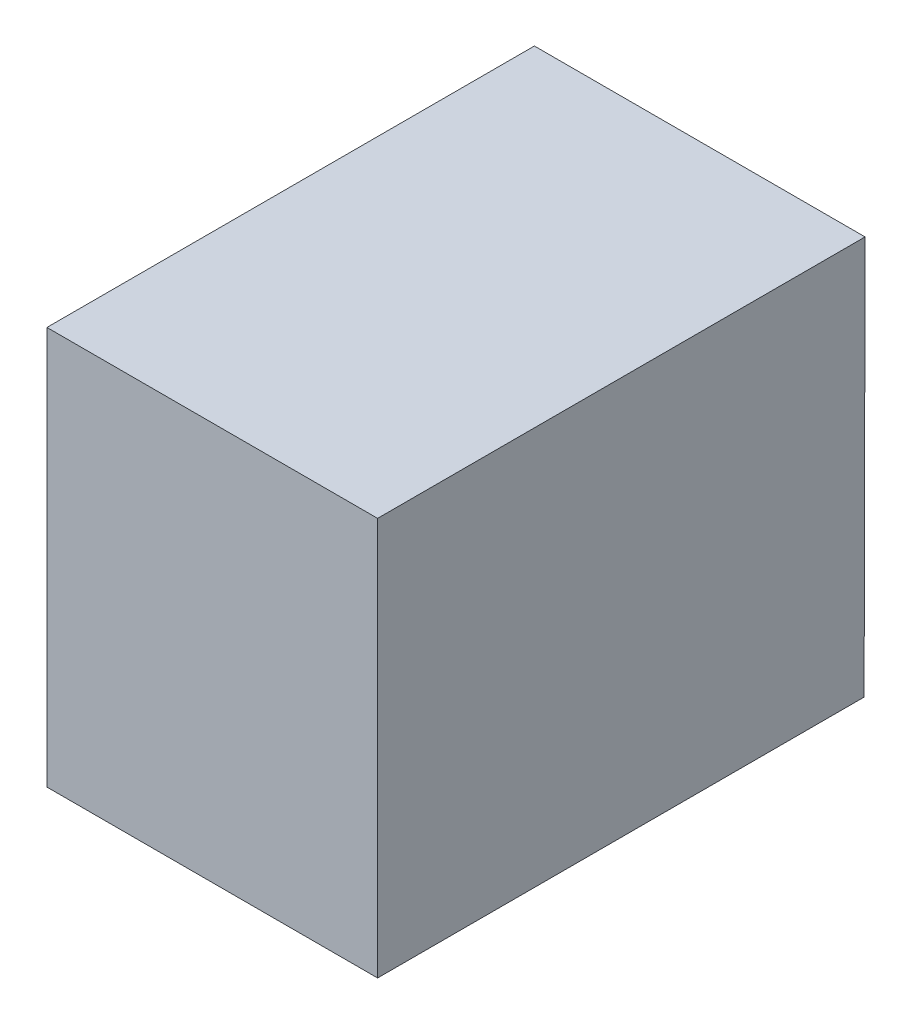
ISO-10303-21;
HEADER;
FILE_DESCRIPTION(('STEP AP214'),'2;1');
FILE_NAME('part.step','',(''),(''),'','','');
FILE_SCHEMA(('AUTOMOTIVE_DESIGN { 1 0 10303 214 1 1 1 1 }'));
ENDSEC;
DATA;
#1=APPLICATION_CONTEXT('core data for automotive mechanical design processes');
#2=APPLICATION_PROTOCOL_DEFINITION('international standard','automotive_design',2000,#1);
#3=PRODUCT_CONTEXT('',#1,'mechanical');
#4=PRODUCT('Part','Part','',(#3));
#5=PRODUCT_RELATED_PRODUCT_CATEGORY('part','',(#4));
#6=PRODUCT_DEFINITION_FORMATION('','',#4);
#7=PRODUCT_DEFINITION_CONTEXT('part definition',#1,'design');
#8=PRODUCT_DEFINITION('design','',#6,#7);
#9=PRODUCT_DEFINITION_SHAPE('','',#8);
#10=(LENGTH_UNIT() NAMED_UNIT(*) SI_UNIT(.MILLI.,.METRE.));
#11=(NAMED_UNIT(*) PLANE_ANGLE_UNIT() SI_UNIT($,.RADIAN.));
#12=(NAMED_UNIT(*) SI_UNIT($,.STERADIAN.) SOLID_ANGLE_UNIT());
#13=UNCERTAINTY_MEASURE_WITH_UNIT(LENGTH_MEASURE(1.E-05),#10,'distance_accuracy_value','');
#14=(GEOMETRIC_REPRESENTATION_CONTEXT(3) GLOBAL_UNCERTAINTY_ASSIGNED_CONTEXT((#13)) GLOBAL_UNIT_ASSIGNED_CONTEXT((#10,
#11,#12)) REPRESENTATION_CONTEXT('',''));
#15=CARTESIAN_POINT('',(0.,0.,0.));
#16=DIRECTION('',(0.,0.,1.));
#17=DIRECTION('',(1.,0.,0.));
#18=AXIS2_PLACEMENT_3D('',#15,#16,#17);
#19=CARTESIAN_POINT('',(-100.2,-54.,-68.8));
#20=DIRECTION('',(-1.,0.,0.));
#21=DIRECTION('',(0.,0.,1.));
#22=AXIS2_PLACEMENT_3D('',#19,#20,#21);
#23=PLANE('',#22);
#24=DIRECTION('',(0.,0.,1.));
#25=VECTOR('',#24,1.);
#26=CARTESIAN_POINT('',(-100.2,-34.94251995706,-68.8));
#27=LINE('',#26,#25);
#28=CARTESIAN_POINT('',(-100.2,-34.9425199575582,-12.7367436987511));
#29=VERTEX_POINT('',#28);
#30=CARTESIAN_POINT('',(-100.199999999925,-34.94251995706,-6.92509816158961));
#31=VERTEX_POINT('',#30);
#32=EDGE_CURVE('E58',#29,#31,#27,.T.);
#33=ORIENTED_EDGE('',*,*,#32,.T.);
#34=DIRECTION('',(0.,1.,0.));
#35=VECTOR('',#34,1.);
#36=CARTESIAN_POINT('',(-100.199999999699,-32.56498733975,-6.92509764656123));
#37=LINE('',#36,#35);
#38=CARTESIAN_POINT('',(-100.19999999985,-30.1874940436016,-6.92509764656123));
#39=VERTEX_POINT('',#38);
#40=EDGE_CURVE('E53',#39,#31,#37,.F.);
#41=ORIENTED_EDGE('',*,*,#40,.F.);
#42=DIRECTION('',(0.,0.,1.));
#43=VECTOR('',#42,1.);
#44=CARTESIAN_POINT('',(-100.2,-30.1874940436016,-9.836521772214));
#45=LINE('',#44,#43);
#46=CARTESIAN_POINT('',(-100.2,-30.1874940436016,-12.7480051298377));
#47=VERTEX_POINT('',#46);
#48=EDGE_CURVE('E56',#47,#39,#45,.T.);
#49=ORIENTED_EDGE('',*,*,#48,.F.);
#50=DIRECTION('',(0.,0.999997195537945,-0.00236831506454706));
#51=VECTOR('',#50,1.);
#52=CARTESIAN_POINT('',(-100.2,-34.9424759710886,-12.7367438029252));
#53=LINE('',#52,#51);
#54=EDGE_CURVE('E70',#47,#29,#53,.F.);
#55=ORIENTED_EDGE('',*,*,#54,.T.);
#56=EDGE_LOOP('',(#33,#41,#49,#55));
#57=FACE_BOUND('',#56,.T.);
#58=ADVANCED_FACE('F17',(#57),#23,.T.);
#59=CARTESIAN_POINT('',(-98.22499351073,-32.56498733975,-6.925098676621));
#60=DIRECTION('',(5.21547538801281E-07,0.,0.999999999999864));
#61=DIRECTION('',(0.999999999999864,0.,-5.21547538801281E-07));
#62=AXIS2_PLACEMENT_3D('',#59,#60,#61);
#63=PLANE('',#62);
#64=DIRECTION('',(0.999999999910853,1.3342451356658E-05,-5.21547538754858E-07));
#65=VECTOR('',#64,1.);
#66=CARTESIAN_POINT('',(-98.2249677389744,-30.1874676918297,-6.92509867663444));
#67=LINE('',#66,#65);
#68=CARTESIAN_POINT('',(-96.2500000004695,-30.1874413409188,-6.9250996494485));
#69=VERTEX_POINT('',#68);
#70=EDGE_CURVE('E20',#39,#69,#67,.T.);
#71=ORIENTED_EDGE('',*,*,#70,.F.);
#72=ORIENTED_EDGE('',*,*,#40,.T.);
#73=DIRECTION('',(1.,0.,0.));
#74=VECTOR('',#73,1.);
#75=CARTESIAN_POINT('',(-98.225,-34.94251995706,-6.925098676618));
#76=LINE('',#75,#74);
#77=CARTESIAN_POINT('',(-96.25,-34.94251995706,-6.9250991344205));
#78=VERTEX_POINT('',#77);
#79=EDGE_CURVE('E75',#31,#78,#76,.T.);
#80=ORIENTED_EDGE('',*,*,#79,.T.);
#81=DIRECTION('',(0.,1.,0.));
#82=VECTOR('',#81,1.);
#83=CARTESIAN_POINT('',(-96.25,-54.,-6.925099592223));
#84=LINE('',#83,#82);
#85=EDGE_CURVE('E74',#78,#69,#84,.T.);
#86=ORIENTED_EDGE('',*,*,#85,.T.);
#87=EDGE_LOOP('',(#71,#72,#80,#86));
#88=FACE_BOUND('',#87,.T.);
#89=ADVANCED_FACE('F72',(#88),#63,.T.);
#90=CARTESIAN_POINT('',(-98.22496925742,-30.18746769185,-9.836521772214));
#91=DIRECTION('',(-1.33424513566599E-05,0.99999999991099,0.));
#92=DIRECTION('',(-0.99999999991099,-1.33424513566599E-05,0.));
#93=AXIS2_PLACEMENT_3D('',#90,#91,#92);
#94=PLANE('',#93);
#95=DIRECTION('',(-0.99999999991099,-1.33424513566599E-05,0.));
#96=VECTOR('',#95,1.);
#97=CARTESIAN_POINT('',(-98.22496925742,-30.18746769185,-12.74800609296));
#98=LINE('',#97,#96);
#99=CARTESIAN_POINT('',(-96.250000000313,-30.1874413409188,-12.7480056737852));
#100=VERTEX_POINT('',#99);
#101=EDGE_CURVE('E69',#100,#47,#98,.T.);
#102=ORIENTED_EDGE('',*,*,#101,.T.);
#103=ORIENTED_EDGE('',*,*,#48,.T.);
#104=ORIENTED_EDGE('',*,*,#70,.T.);
#105=DIRECTION('',(0.,0.,1.));
#106=VECTOR('',#105,1.);
#107=CARTESIAN_POINT('',(-96.250000000626,-30.1874413409188,-9.836521772214));
#108=LINE('',#107,#106);
#109=EDGE_CURVE('E77',#69,#100,#108,.F.);
#110=ORIENTED_EDGE('',*,*,#109,.T.);
#111=EDGE_LOOP('',(#102,#103,#104,#110));
#112=FACE_BOUND('',#111,.T.);
#113=ADVANCED_FACE('F66',(#112),#94,.T.);
#114=CARTESIAN_POINT('',(-98.22492057204,-32.56497381771,-12.74237449286));
#115=DIRECTION('',(-1.1194765665958E-11,0.00236831506454811,0.999997195537945));
#116=DIRECTION('',(0.,-0.999997195537945,0.00236831506454811));
#117=AXIS2_PLACEMENT_3D('',#114,#115,#116);
#118=PLANE('',#117);
#119=DIRECTION('',(0.,-0.999997195537945,0.00236831506454811));
#120=VECTOR('',#119,1.);
#121=CARTESIAN_POINT('',(-96.25,-32.5649738177099,-12.7423744928379));
#122=LINE('',#121,#120);
#123=CARTESIAN_POINT('',(-96.25,-34.94251995706,-12.7367436987081));
#124=VERTEX_POINT('',#123);
#125=EDGE_CURVE('E26',#100,#124,#122,.T.);
#126=ORIENTED_EDGE('',*,*,#125,.T.);
#127=DIRECTION('',(1.,0.,1.11947342706625E-11));
#128=VECTOR('',#127,1.);
#129=CARTESIAN_POINT('',(-98.22492057204,-34.9425199580563,-12.7367436987278));
#130=LINE('',#129,#128);
#131=EDGE_CURVE('E34',#124,#29,#130,.F.);
#132=ORIENTED_EDGE('',*,*,#131,.T.);
#133=ORIENTED_EDGE('',*,*,#54,.F.);
#134=ORIENTED_EDGE('',*,*,#101,.F.);
#135=EDGE_LOOP('',(#126,#132,#133,#134));
#136=FACE_BOUND('',#135,.T.);
#137=ADVANCED_FACE('F88',(#136),#118,.F.);
#138=CARTESIAN_POINT('',(-98.225,-34.94251995706,-9.830920278516));
#139=DIRECTION('',(0.,1.,0.));
#140=DIRECTION('',(0.,0.,1.));
#141=AXIS2_PLACEMENT_3D('',#138,#139,#140);
#142=PLANE('',#141);
#143=DIRECTION('',(0.,0.,1.));
#144=VECTOR('',#143,1.);
#145=CARTESIAN_POINT('',(-96.25,-34.94251995706,-9.830920278516));
#146=LINE('',#145,#144);
#147=EDGE_CURVE('E11',#124,#78,#146,.T.);
#148=ORIENTED_EDGE('',*,*,#147,.T.);
#149=ORIENTED_EDGE('',*,*,#79,.F.);
#150=ORIENTED_EDGE('',*,*,#32,.F.);
#151=ORIENTED_EDGE('',*,*,#131,.F.);
#152=EDGE_LOOP('',(#148,#149,#150,#151));
#153=FACE_BOUND('',#152,.T.);
#154=ADVANCED_FACE('F91',(#153),#142,.F.);
#155=CARTESIAN_POINT('',(-96.25,-54.,-68.8));
#156=DIRECTION('',(-1.,0.,0.));
#157=DIRECTION('',(0.,0.,1.));
#158=AXIS2_PLACEMENT_3D('',#155,#156,#157);
#159=PLANE('',#158);
#160=ORIENTED_EDGE('',*,*,#125,.F.);
#161=ORIENTED_EDGE('',*,*,#109,.F.);
#162=ORIENTED_EDGE('',*,*,#85,.F.);
#163=ORIENTED_EDGE('',*,*,#147,.F.);
#164=EDGE_LOOP('',(#160,#161,#162,#163));
#165=FACE_BOUND('',#164,.T.);
#166=ADVANCED_FACE('F90',(#165),#159,.F.);
#167=CLOSED_SHELL('',(#58,#89,#113,#137,#154,#166));
#168=MANIFOLD_SOLID_BREP('B1',#167);
#169=ADVANCED_BREP_SHAPE_REPRESENTATION('',(#18,#168),#14);
#170=SHAPE_DEFINITION_REPRESENTATION(#9,#169);
ENDSEC;
END-ISO-10303-21;
